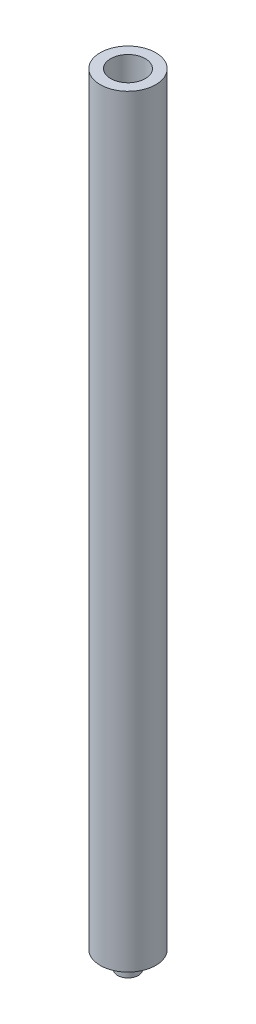
ISO-10303-21;
HEADER;
FILE_DESCRIPTION(('STEP AP214'),'2;1');
FILE_NAME('part.step','',(''),(''),'','','');
FILE_SCHEMA(('AUTOMOTIVE_DESIGN { 1 0 10303 214 1 1 1 1 }'));
ENDSEC;
DATA;
#1=APPLICATION_CONTEXT('core data for automotive mechanical design processes');
#2=APPLICATION_PROTOCOL_DEFINITION('international standard','automotive_design',2000,#1);
#3=PRODUCT_CONTEXT('',#1,'mechanical');
#4=PRODUCT('Part','Part','',(#3));
#5=PRODUCT_RELATED_PRODUCT_CATEGORY('part','',(#4));
#6=PRODUCT_DEFINITION_FORMATION('','',#4);
#7=PRODUCT_DEFINITION_CONTEXT('part definition',#1,'design');
#8=PRODUCT_DEFINITION('design','',#6,#7);
#9=PRODUCT_DEFINITION_SHAPE('','',#8);
#10=(LENGTH_UNIT() NAMED_UNIT(*) SI_UNIT(.MILLI.,.METRE.));
#11=(NAMED_UNIT(*) PLANE_ANGLE_UNIT() SI_UNIT($,.RADIAN.));
#12=(NAMED_UNIT(*) SI_UNIT($,.STERADIAN.) SOLID_ANGLE_UNIT());
#13=UNCERTAINTY_MEASURE_WITH_UNIT(LENGTH_MEASURE(1.E-05),#10,'distance_accuracy_value','');
#14=(GEOMETRIC_REPRESENTATION_CONTEXT(3) GLOBAL_UNCERTAINTY_ASSIGNED_CONTEXT((#13)) GLOBAL_UNIT_ASSIGNED_CONTEXT((#10,
#11,#12)) REPRESENTATION_CONTEXT('',''));
#15=CARTESIAN_POINT('',(0.,0.,0.));
#16=DIRECTION('',(0.,0.,1.));
#17=DIRECTION('',(1.,0.,0.));
#18=AXIS2_PLACEMENT_3D('',#15,#16,#17);
#19=CARTESIAN_POINT('',(0.,-40.,0.));
#20=DIRECTION('',(0.,1.,0.));
#21=DIRECTION('',(0.,0.,1.));
#22=AXIS2_PLACEMENT_3D('',#19,#20,#21);
#23=CYLINDRICAL_SURFACE('',#22,4.);
#24=CARTESIAN_POINT('',(0.,-40.,0.));
#25=DIRECTION('',(0.,1.,0.));
#26=DIRECTION('',(0.,0.,1.));
#27=AXIS2_PLACEMENT_3D('',#24,#25,#26);
#28=CIRCLE('',#27,4.);
#29=CARTESIAN_POINT('',(0.,-40.,4.));
#30=VERTEX_POINT('',#29);
#31=EDGE_CURVE('E44',#30,#30,#28,.T.);
#32=ORIENTED_EDGE('',*,*,#31,.T.);
#33=EDGE_LOOP('',(#32));
#34=FACE_BOUND('',#33,.T.);
#35=CARTESIAN_POINT('',(0.,70.,0.));
#36=DIRECTION('',(0.,1.,0.));
#37=DIRECTION('',(0.,0.,1.));
#38=AXIS2_PLACEMENT_3D('',#35,#36,#37);
#39=CIRCLE('',#38,4.);
#40=CARTESIAN_POINT('',(0.,70.,4.));
#41=VERTEX_POINT('',#40);
#42=EDGE_CURVE('E58',#41,#41,#39,.T.);
#43=ORIENTED_EDGE('',*,*,#42,.F.);
#44=EDGE_LOOP('',(#43));
#45=FACE_BOUND('',#44,.T.);
#46=ADVANCED_FACE('F41',(#34,#45),#23,.T.);
#47=CARTESIAN_POINT('',(0.,-40.,0.));
#48=DIRECTION('',(0.,1.,0.));
#49=DIRECTION('',(0.,0.,1.));
#50=AXIS2_PLACEMENT_3D('',#47,#48,#49);
#51=PLANE('',#50);
#52=CARTESIAN_POINT('',(0.,-40.,0.));
#53=DIRECTION('',(0.,-1.,0.));
#54=DIRECTION('',(0.,0.,-1.));
#55=AXIS2_PLACEMENT_3D('',#52,#53,#54);
#56=CIRCLE('',#55,1.5);
#57=CARTESIAN_POINT('',(0.,-40.,-1.5));
#58=VERTEX_POINT('',#57);
#59=EDGE_CURVE('E10',#58,#58,#56,.T.);
#60=ORIENTED_EDGE('',*,*,#59,.F.);
#61=EDGE_LOOP('',(#60));
#62=FACE_BOUND('',#61,.T.);
#63=ORIENTED_EDGE('',*,*,#31,.F.);
#64=EDGE_LOOP('',(#63));
#65=FACE_BOUND('',#64,.T.);
#66=ADVANCED_FACE('F87',(#62,#65),#51,.F.);
#67=CARTESIAN_POINT('',(0.,-42.5,0.));
#68=DIRECTION('',(0.,1.,0.));
#69=DIRECTION('',(0.,0.,1.));
#70=AXIS2_PLACEMENT_3D('',#67,#68,#69);
#71=CYLINDRICAL_SURFACE('',#70,1.5);
#72=CARTESIAN_POINT('',(0.,-42.5,0.));
#73=DIRECTION('',(0.,-1.,0.));
#74=DIRECTION('',(0.,0.,-1.));
#75=AXIS2_PLACEMENT_3D('',#72,#73,#74);
#76=CIRCLE('',#75,1.5);
#77=CARTESIAN_POINT('',(0.,-42.5,-1.5));
#78=VERTEX_POINT('',#77);
#79=EDGE_CURVE('E53',#78,#78,#76,.T.);
#80=ORIENTED_EDGE('',*,*,#79,.F.);
#81=EDGE_LOOP('',(#80));
#82=FACE_BOUND('',#81,.T.);
#83=ORIENTED_EDGE('',*,*,#59,.T.);
#84=EDGE_LOOP('',(#83));
#85=FACE_BOUND('',#84,.T.);
#86=ADVANCED_FACE('F93',(#82,#85),#71,.T.);
#87=CARTESIAN_POINT('',(0.,-42.5,0.));
#88=DIRECTION('',(0.,-1.,0.));
#89=DIRECTION('',(0.,0.,-1.));
#90=AXIS2_PLACEMENT_3D('',#87,#88,#89);
#91=PLANE('',#90);
#92=ORIENTED_EDGE('',*,*,#79,.T.);
#93=EDGE_LOOP('',(#92));
#94=FACE_BOUND('',#93,.T.);
#95=ADVANCED_FACE('F82',(#94),#91,.T.);
#96=CARTESIAN_POINT('',(0.,70.,0.));
#97=DIRECTION('',(0.,1.,0.));
#98=DIRECTION('',(0.,0.,1.));
#99=AXIS2_PLACEMENT_3D('',#96,#97,#98);
#100=PLANE('',#99);
#101=CARTESIAN_POINT('',(0.,70.,0.));
#102=DIRECTION('',(0.,1.,0.));
#103=DIRECTION('',(0.,0.,1.));
#104=AXIS2_PLACEMENT_3D('',#101,#102,#103);
#105=CIRCLE('',#104,2.5);
#106=CARTESIAN_POINT('',(0.,70.,2.5));
#107=VERTEX_POINT('',#106);
#108=EDGE_CURVE('E63',#107,#107,#105,.T.);
#109=ORIENTED_EDGE('',*,*,#108,.F.);
#110=EDGE_LOOP('',(#109));
#111=FACE_BOUND('',#110,.T.);
#112=ORIENTED_EDGE('',*,*,#42,.T.);
#113=EDGE_LOOP('',(#112));
#114=FACE_BOUND('',#113,.T.);
#115=ADVANCED_FACE('F76',(#111,#114),#100,.T.);
#116=CARTESIAN_POINT('',(0.,60.,0.));
#117=DIRECTION('',(0.,1.,0.));
#118=DIRECTION('',(0.,0.,1.));
#119=AXIS2_PLACEMENT_3D('',#116,#117,#118);
#120=CYLINDRICAL_SURFACE('',#119,2.5);
#121=CARTESIAN_POINT('',(0.,60.,0.));
#122=DIRECTION('',(0.,1.,0.));
#123=DIRECTION('',(0.,0.,1.));
#124=AXIS2_PLACEMENT_3D('',#121,#122,#123);
#125=CIRCLE('',#124,2.5);
#126=CARTESIAN_POINT('',(0.,60.,2.5));
#127=VERTEX_POINT('',#126);
#128=EDGE_CURVE('E62',#127,#127,#125,.T.);
#129=ORIENTED_EDGE('',*,*,#128,.F.);
#130=EDGE_LOOP('',(#129));
#131=FACE_BOUND('',#130,.T.);
#132=ORIENTED_EDGE('',*,*,#108,.T.);
#133=EDGE_LOOP('',(#132));
#134=FACE_BOUND('',#133,.T.);
#135=ADVANCED_FACE('F73',(#131,#134),#120,.F.);
#136=CARTESIAN_POINT('',(0.,60.,0.));
#137=DIRECTION('',(0.,1.,0.));
#138=DIRECTION('',(0.,0.,1.));
#139=AXIS2_PLACEMENT_3D('',#136,#137,#138);
#140=PLANE('',#139);
#141=ORIENTED_EDGE('',*,*,#128,.T.);
#142=EDGE_LOOP('',(#141));
#143=FACE_BOUND('',#142,.T.);
#144=ADVANCED_FACE('F71',(#143),#140,.T.);
#145=CLOSED_SHELL('',(#46,#66,#86,#95,#115,#135,#144));
#146=MANIFOLD_SOLID_BREP('B2',#145);
#147=ADVANCED_BREP_SHAPE_REPRESENTATION('',(#18,#146),#14);
#148=SHAPE_DEFINITION_REPRESENTATION(#9,#147);
ENDSEC;
END-ISO-10303-21;
